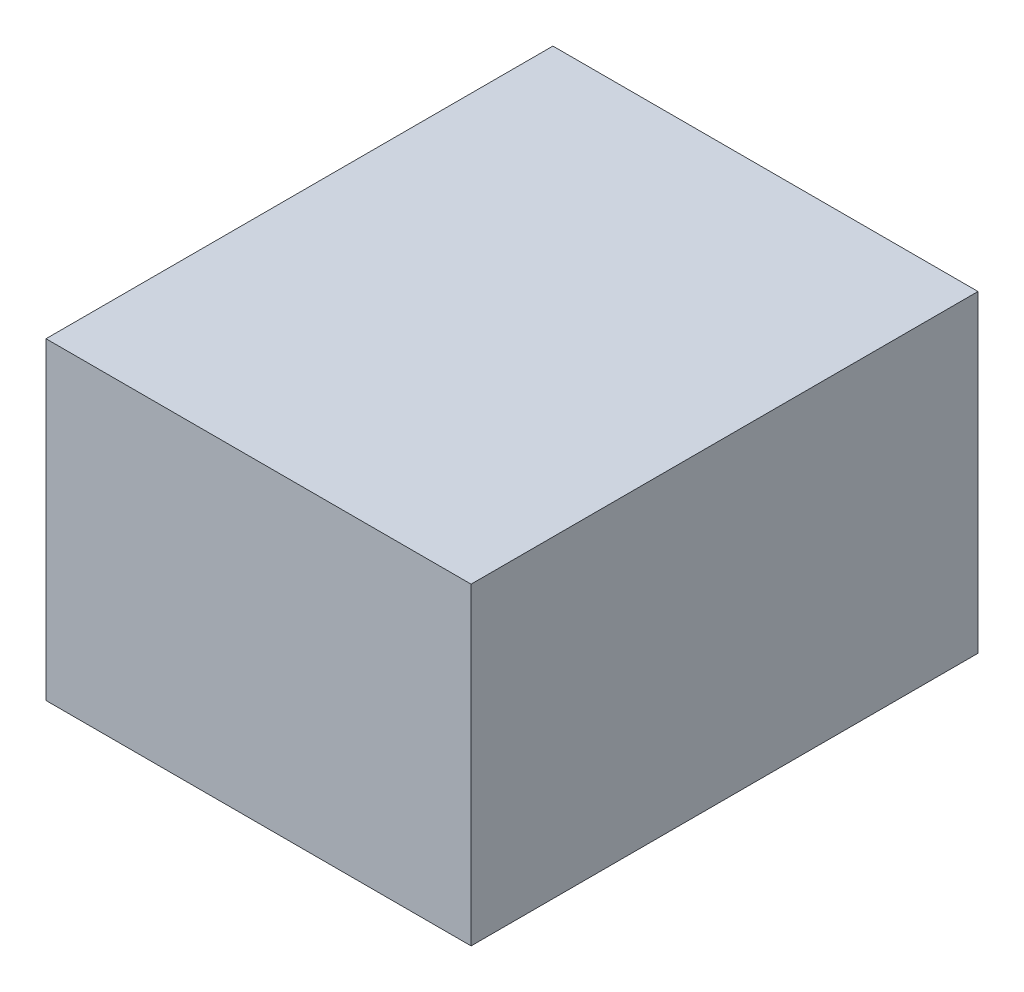
ISO-10303-21;
HEADER;
FILE_DESCRIPTION(('STEP AP214'),'2;1');
FILE_NAME('part.step','',(''),(''),'','','');
FILE_SCHEMA(('AUTOMOTIVE_DESIGN { 1 0 10303 214 1 1 1 1 }'));
ENDSEC;
DATA;
#1=APPLICATION_CONTEXT('core data for automotive mechanical design processes');
#2=APPLICATION_PROTOCOL_DEFINITION('international standard','automotive_design',2000,#1);
#3=PRODUCT_CONTEXT('',#1,'mechanical');
#4=PRODUCT('Part','Part','',(#3));
#5=PRODUCT_RELATED_PRODUCT_CATEGORY('part','',(#4));
#6=PRODUCT_DEFINITION_FORMATION('','',#4);
#7=PRODUCT_DEFINITION_CONTEXT('part definition',#1,'design');
#8=PRODUCT_DEFINITION('design','',#6,#7);
#9=PRODUCT_DEFINITION_SHAPE('','',#8);
#10=(LENGTH_UNIT() NAMED_UNIT(*) SI_UNIT(.MILLI.,.METRE.));
#11=(NAMED_UNIT(*) PLANE_ANGLE_UNIT() SI_UNIT($,.RADIAN.));
#12=(NAMED_UNIT(*) SI_UNIT($,.STERADIAN.) SOLID_ANGLE_UNIT());
#13=UNCERTAINTY_MEASURE_WITH_UNIT(LENGTH_MEASURE(1.E-05),#10,'distance_accuracy_value','');
#14=(GEOMETRIC_REPRESENTATION_CONTEXT(3) GLOBAL_UNCERTAINTY_ASSIGNED_CONTEXT((#13)) GLOBAL_UNIT_ASSIGNED_CONTEXT((#10,
#11,#12)) REPRESENTATION_CONTEXT('',''));
#15=CARTESIAN_POINT('',(0.,0.,0.));
#16=DIRECTION('',(0.,0.,1.));
#17=DIRECTION('',(1.,0.,0.));
#18=AXIS2_PLACEMENT_3D('',#15,#16,#17);
#19=CARTESIAN_POINT('',(0.,15.7,0.));
#20=DIRECTION('',(0.,0.,-1.));
#21=DIRECTION('',(-1.,0.,0.));
#22=AXIS2_PLACEMENT_3D('',#19,#20,#21);
#23=PLANE('',#22);
#24=DIRECTION('',(1.,0.,0.));
#25=VECTOR('',#24,1.);
#26=CARTESIAN_POINT('',(0.,0.,0.));
#27=LINE('',#26,#25);
#28=CARTESIAN_POINT('',(0.,0.,0.));
#29=VERTEX_POINT('',#28);
#30=CARTESIAN_POINT('',(21.3000000000001,0.,0.));
#31=VERTEX_POINT('',#30);
#32=EDGE_CURVE('E98',#29,#31,#27,.T.);
#33=ORIENTED_EDGE('',*,*,#32,.T.);
#34=DIRECTION('',(0.,-1.,0.));
#35=VECTOR('',#34,1.);
#36=CARTESIAN_POINT('',(21.3000000000001,15.7,0.));
#37=LINE('',#36,#35);
#38=CARTESIAN_POINT('',(21.3000000000001,15.7,0.));
#39=VERTEX_POINT('',#38);
#40=EDGE_CURVE('E11',#39,#31,#37,.T.);
#41=ORIENTED_EDGE('',*,*,#40,.F.);
#42=DIRECTION('',(1.,0.,0.));
#43=VECTOR('',#42,1.);
#44=CARTESIAN_POINT('',(0.,15.7,0.));
#45=LINE('',#44,#43);
#46=CARTESIAN_POINT('',(0.,15.7,0.));
#47=VERTEX_POINT('',#46);
#48=EDGE_CURVE('E84',#47,#39,#45,.T.);
#49=ORIENTED_EDGE('',*,*,#48,.F.);
#50=DIRECTION('',(0.,-1.,0.));
#51=VECTOR('',#50,1.);
#52=CARTESIAN_POINT('',(0.,15.7,0.));
#53=LINE('',#52,#51);
#54=EDGE_CURVE('E51',#47,#29,#53,.T.);
#55=ORIENTED_EDGE('',*,*,#54,.T.);
#56=EDGE_LOOP('',(#33,#41,#49,#55));
#57=FACE_BOUND('',#56,.T.);
#58=ADVANCED_FACE('F35',(#57),#23,.F.);
#59=CARTESIAN_POINT('',(21.3000000000001,15.7,0.));
#60=DIRECTION('',(-1.,0.,0.));
#61=DIRECTION('',(0.,0.,1.));
#62=AXIS2_PLACEMENT_3D('',#59,#60,#61);
#63=PLANE('',#62);
#64=DIRECTION('',(0.,0.,-1.));
#65=VECTOR('',#64,1.);
#66=CARTESIAN_POINT('',(21.3000000000001,0.,0.));
#67=LINE('',#66,#65);
#68=CARTESIAN_POINT('',(21.3,0.,-25.4));
#69=VERTEX_POINT('',#68);
#70=EDGE_CURVE('E89',#31,#69,#67,.T.);
#71=ORIENTED_EDGE('',*,*,#70,.T.);
#72=DIRECTION('',(0.,-1.,0.));
#73=VECTOR('',#72,1.);
#74=CARTESIAN_POINT('',(21.3,15.7,-25.4));
#75=LINE('',#74,#73);
#76=CARTESIAN_POINT('',(21.3,15.7,-25.4));
#77=VERTEX_POINT('',#76);
#78=EDGE_CURVE('E43',#77,#69,#75,.T.);
#79=ORIENTED_EDGE('',*,*,#78,.F.);
#80=DIRECTION('',(0.,0.,-1.));
#81=VECTOR('',#80,1.);
#82=CARTESIAN_POINT('',(21.3000000000001,15.7,0.));
#83=LINE('',#82,#81);
#84=EDGE_CURVE('E76',#39,#77,#83,.T.);
#85=ORIENTED_EDGE('',*,*,#84,.F.);
#86=ORIENTED_EDGE('',*,*,#40,.T.);
#87=EDGE_LOOP('',(#71,#79,#85,#86));
#88=FACE_BOUND('',#87,.T.);
#89=ADVANCED_FACE('F88',(#88),#63,.F.);
#90=CARTESIAN_POINT('',(0.,15.7,-25.4));
#91=DIRECTION('',(0.,0.,-1.));
#92=DIRECTION('',(-1.,0.,0.));
#93=AXIS2_PLACEMENT_3D('',#90,#91,#92);
#94=PLANE('',#93);
#95=DIRECTION('',(1.,0.,0.));
#96=VECTOR('',#95,1.);
#97=CARTESIAN_POINT('',(0.,0.,-25.4));
#98=LINE('',#97,#96);
#99=CARTESIAN_POINT('',(0.,0.,-25.4));
#100=VERTEX_POINT('',#99);
#101=EDGE_CURVE('E101',#100,#69,#98,.T.);
#102=ORIENTED_EDGE('',*,*,#101,.F.);
#103=DIRECTION('',(0.,-1.,0.));
#104=VECTOR('',#103,1.);
#105=CARTESIAN_POINT('',(0.,15.7,-25.4));
#106=LINE('',#105,#104);
#107=CARTESIAN_POINT('',(0.,15.7,-25.4));
#108=VERTEX_POINT('',#107);
#109=EDGE_CURVE('E65',#108,#100,#106,.T.);
#110=ORIENTED_EDGE('',*,*,#109,.F.);
#111=DIRECTION('',(1.,0.,0.));
#112=VECTOR('',#111,1.);
#113=CARTESIAN_POINT('',(0.,15.7,-25.4));
#114=LINE('',#113,#112);
#115=EDGE_CURVE('E83',#108,#77,#114,.T.);
#116=ORIENTED_EDGE('',*,*,#115,.T.);
#117=ORIENTED_EDGE('',*,*,#78,.T.);
#118=EDGE_LOOP('',(#102,#110,#116,#117));
#119=FACE_BOUND('',#118,.T.);
#120=ADVANCED_FACE('F92',(#119),#94,.T.);
#121=CARTESIAN_POINT('',(0.,15.7,0.));
#122=DIRECTION('',(-1.,0.,0.));
#123=DIRECTION('',(0.,0.,1.));
#124=AXIS2_PLACEMENT_3D('',#121,#122,#123);
#125=PLANE('',#124);
#126=DIRECTION('',(0.,0.,-1.));
#127=VECTOR('',#126,1.);
#128=CARTESIAN_POINT('',(0.,0.,0.));
#129=LINE('',#128,#127);
#130=EDGE_CURVE('E103',#29,#100,#129,.T.);
#131=ORIENTED_EDGE('',*,*,#130,.F.);
#132=ORIENTED_EDGE('',*,*,#54,.F.);
#133=DIRECTION('',(0.,0.,-1.));
#134=VECTOR('',#133,1.);
#135=CARTESIAN_POINT('',(0.,15.7,0.));
#136=LINE('',#135,#134);
#137=EDGE_CURVE('E93',#47,#108,#136,.T.);
#138=ORIENTED_EDGE('',*,*,#137,.T.);
#139=ORIENTED_EDGE('',*,*,#109,.T.);
#140=EDGE_LOOP('',(#131,#132,#138,#139));
#141=FACE_BOUND('',#140,.T.);
#142=ADVANCED_FACE('F109',(#141),#125,.T.);
#143=CARTESIAN_POINT('',(0.,15.7,0.));
#144=DIRECTION('',(0.,1.,0.));
#145=DIRECTION('',(0.,0.,1.));
#146=AXIS2_PLACEMENT_3D('',#143,#144,#145);
#147=PLANE('',#146);
#148=ORIENTED_EDGE('',*,*,#48,.T.);
#149=ORIENTED_EDGE('',*,*,#84,.T.);
#150=ORIENTED_EDGE('',*,*,#115,.F.);
#151=ORIENTED_EDGE('',*,*,#137,.F.);
#152=EDGE_LOOP('',(#148,#149,#150,#151));
#153=FACE_BOUND('',#152,.T.);
#154=ADVANCED_FACE('F80',(#153),#147,.T.);
#155=CARTESIAN_POINT('',(0.,0.,0.));
#156=DIRECTION('',(0.,1.,0.));
#157=DIRECTION('',(0.,0.,1.));
#158=AXIS2_PLACEMENT_3D('',#155,#156,#157);
#159=PLANE('',#158);
#160=ORIENTED_EDGE('',*,*,#32,.F.);
#161=ORIENTED_EDGE('',*,*,#130,.T.);
#162=ORIENTED_EDGE('',*,*,#101,.T.);
#163=ORIENTED_EDGE('',*,*,#70,.F.);
#164=EDGE_LOOP('',(#160,#161,#162,#163));
#165=FACE_BOUND('',#164,.T.);
#166=ADVANCED_FACE('F108',(#165),#159,.F.);
#167=CLOSED_SHELL('',(#58,#89,#120,#142,#154,#166));
#168=MANIFOLD_SOLID_BREP('B2',#167);
#169=ADVANCED_BREP_SHAPE_REPRESENTATION('',(#18,#168),#14);
#170=SHAPE_DEFINITION_REPRESENTATION(#9,#169);
ENDSEC;
END-ISO-10303-21;
